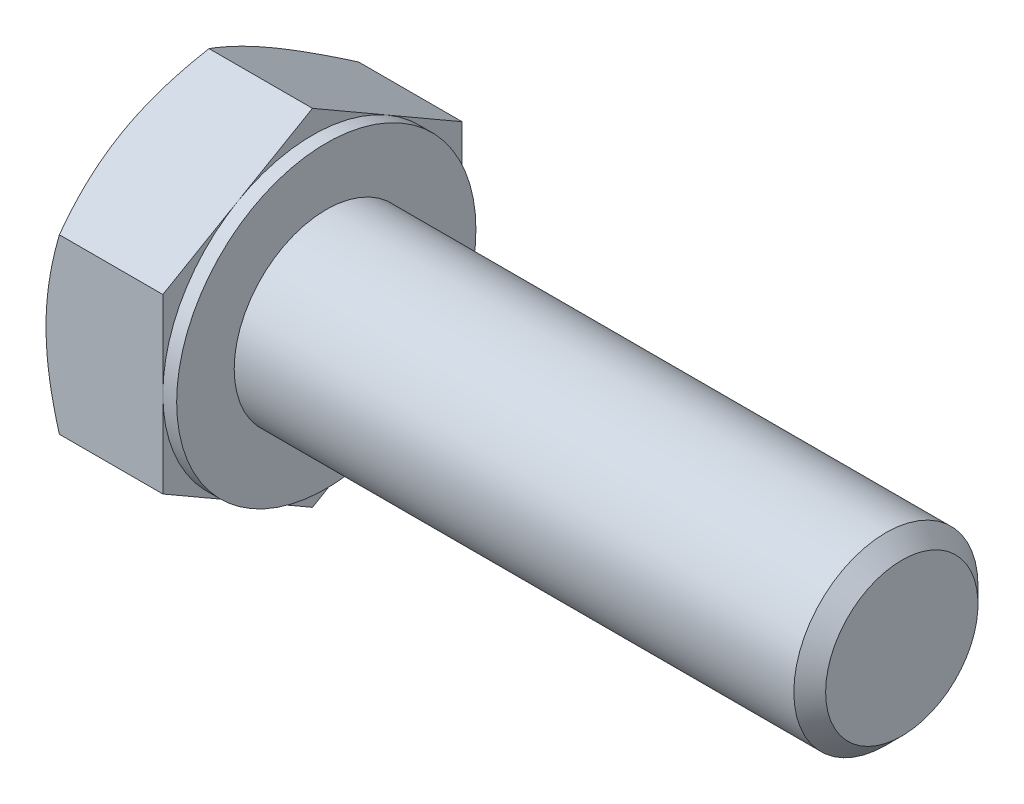
ISO-10303-21;
HEADER;
FILE_DESCRIPTION(('STEP AP214'),'2;1');
FILE_NAME('part.step','',(''),(''),'','','');
FILE_SCHEMA(('AUTOMOTIVE_DESIGN { 1 0 10303 214 1 1 1 1 }'));
ENDSEC;
DATA;
#1=APPLICATION_CONTEXT('core data for automotive mechanical design processes');
#2=APPLICATION_PROTOCOL_DEFINITION('international standard','automotive_design',2000,#1);
#3=PRODUCT_CONTEXT('',#1,'mechanical');
#4=PRODUCT('Part','Part','',(#3));
#5=PRODUCT_RELATED_PRODUCT_CATEGORY('part','',(#4));
#6=PRODUCT_DEFINITION_FORMATION('','',#4);
#7=PRODUCT_DEFINITION_CONTEXT('part definition',#1,'design');
#8=PRODUCT_DEFINITION('design','',#6,#7);
#9=PRODUCT_DEFINITION_SHAPE('','',#8);
#10=(LENGTH_UNIT() NAMED_UNIT(*) SI_UNIT(.MILLI.,.METRE.));
#11=(NAMED_UNIT(*) PLANE_ANGLE_UNIT() SI_UNIT($,.RADIAN.));
#12=(NAMED_UNIT(*) SI_UNIT($,.STERADIAN.) SOLID_ANGLE_UNIT());
#13=UNCERTAINTY_MEASURE_WITH_UNIT(LENGTH_MEASURE(1.E-05),#10,'distance_accuracy_value','');
#14=(GEOMETRIC_REPRESENTATION_CONTEXT(3) GLOBAL_UNCERTAINTY_ASSIGNED_CONTEXT((#13)) GLOBAL_UNIT_ASSIGNED_CONTEXT((#10,
#11,#12)) REPRESENTATION_CONTEXT('',''));
#15=CARTESIAN_POINT('',(0.,0.,0.));
#16=DIRECTION('',(0.,0.,1.));
#17=DIRECTION('',(1.,0.,0.));
#18=AXIS2_PLACEMENT_3D('',#15,#16,#17);
#19=CARTESIAN_POINT('',(5.675,7.50555349946514,0.));
#20=DIRECTION('',(1.,0.,0.));
#21=DIRECTION('',(0.,0.,-1.));
#22=AXIS2_PLACEMENT_3D('',#19,#20,#21);
#23=PLANE('',#22);
#24=CARTESIAN_POINT('',(5.675,0.,0.));
#25=DIRECTION('',(1.,0.,0.));
#26=DIRECTION('',(0.,0.,-1.));
#27=AXIS2_PLACEMENT_3D('',#24,#25,#26);
#28=CIRCLE('',#27,4.);
#29=CARTESIAN_POINT('',(5.675,0.,-4.));
#30=VERTEX_POINT('',#29);
#31=EDGE_CURVE('E273',#30,#30,#28,.F.);
#32=ORIENTED_EDGE('',*,*,#31,.T.);
#33=EDGE_LOOP('',(#32));
#34=FACE_BOUND('',#33,.T.);
#35=CARTESIAN_POINT('',(5.675,0.,0.));
#36=DIRECTION('',(1.,0.,0.));
#37=DIRECTION('',(0.,0.,-1.));
#38=AXIS2_PLACEMENT_3D('',#35,#36,#37);
#39=CIRCLE('',#38,6.5);
#40=CARTESIAN_POINT('',(5.675,0.,-6.5));
#41=VERTEX_POINT('',#40);
#42=EDGE_CURVE('E292',#41,#41,#39,.T.);
#43=ORIENTED_EDGE('',*,*,#42,.T.);
#44=EDGE_LOOP('',(#43));
#45=FACE_BOUND('',#44,.T.);
#46=ADVANCED_FACE('F35',(#34,#45),#23,.T.);
#47=CARTESIAN_POINT('',(0.,0.,0.));
#48=DIRECTION('',(-1.,0.,0.));
#49=DIRECTION('',(0.,0.,1.));
#50=AXIS2_PLACEMENT_3D('',#47,#48,#49);
#51=CYLINDRICAL_SURFACE('',#50,4.);
#52=ORIENTED_EDGE('',*,*,#31,.F.);
#53=EDGE_LOOP('',(#52));
#54=FACE_BOUND('',#53,.T.);
#55=CARTESIAN_POINT('',(29.9845,0.,0.));
#56=DIRECTION('',(-1.,0.,0.));
#57=DIRECTION('',(0.,0.,1.));
#58=AXIS2_PLACEMENT_3D('',#55,#56,#57);
#59=CIRCLE('',#58,4.);
#60=CARTESIAN_POINT('',(29.9845,0.,4.));
#61=VERTEX_POINT('',#60);
#62=EDGE_CURVE('E270',#61,#61,#59,.T.);
#63=ORIENTED_EDGE('',*,*,#62,.T.);
#64=EDGE_LOOP('',(#63));
#65=FACE_BOUND('',#64,.T.);
#66=ADVANCED_FACE('F244',(#54,#65),#51,.T.);
#67=CARTESIAN_POINT('',(30.675,0.,0.));
#68=DIRECTION('',(-1.,0.,0.));
#69=DIRECTION('',(0.,0.,1.));
#70=AXIS2_PLACEMENT_3D('',#67,#68,#69);
#71=CONICAL_SURFACE('',#70,3.3095,0.785398163397451);
#72=ORIENTED_EDGE('',*,*,#62,.F.);
#73=EDGE_LOOP('',(#72));
#74=FACE_BOUND('',#73,.T.);
#75=CARTESIAN_POINT('',(30.675,0.,0.));
#76=DIRECTION('',(-1.,0.,0.));
#77=DIRECTION('',(0.,0.,1.));
#78=AXIS2_PLACEMENT_3D('',#75,#76,#77);
#79=CIRCLE('',#78,3.3095);
#80=CARTESIAN_POINT('',(30.675,0.,3.3095));
#81=VERTEX_POINT('',#80);
#82=EDGE_CURVE('E268',#81,#81,#79,.T.);
#83=ORIENTED_EDGE('',*,*,#82,.T.);
#84=EDGE_LOOP('',(#83));
#85=FACE_BOUND('',#84,.T.);
#86=ADVANCED_FACE('F249',(#74,#85),#71,.T.);
#87=CARTESIAN_POINT('',(30.675,0.,0.));
#88=DIRECTION('',(-1.,0.,0.));
#89=DIRECTION('',(0.,0.,1.));
#90=AXIS2_PLACEMENT_3D('',#87,#88,#89);
#91=PLANE('',#90);
#92=ORIENTED_EDGE('',*,*,#82,.F.);
#93=EDGE_LOOP('',(#92));
#94=FACE_BOUND('',#93,.T.);
#95=ADVANCED_FACE('F256',(#94),#91,.F.);
#96=CARTESIAN_POINT('',(5.075,6.5,0.));
#97=DIRECTION('',(1.,0.,0.));
#98=DIRECTION('',(0.,0.,-1.));
#99=AXIS2_PLACEMENT_3D('',#96,#97,#98);
#100=PLANE('',#99);
#101=DIRECTION('',(0.,0.500000000000001,0.866025403784438));
#102=VECTOR('',#101,1.);
#103=CARTESIAN_POINT('',(5.075,3.75277674973256,-6.5));
#104=LINE('',#103,#102);
#105=CARTESIAN_POINT('',(5.075,3.75277674973256,-6.5));
#106=VERTEX_POINT('',#105);
#107=CARTESIAN_POINT('',(5.075,5.62916512459885,-3.25000000000001));
#108=VERTEX_POINT('',#107);
#109=EDGE_CURVE('E168',#106,#108,#104,.T.);
#110=ORIENTED_EDGE('',*,*,#109,.T.);
#111=CARTESIAN_POINT('',(5.075,0.,0.));
#112=DIRECTION('',(-1.,0.,0.));
#113=DIRECTION('',(0.,0.,1.));
#114=AXIS2_PLACEMENT_3D('',#111,#112,#113);
#115=CIRCLE('',#114,6.5);
#116=CARTESIAN_POINT('',(5.075,0.,-6.5));
#117=VERTEX_POINT('',#116);
#118=EDGE_CURVE('E51',#108,#117,#115,.T.);
#119=ORIENTED_EDGE('',*,*,#118,.T.);
#120=DIRECTION('',(0.,1.,0.));
#121=VECTOR('',#120,1.);
#122=CARTESIAN_POINT('',(5.075,3.75277674973256,-6.5));
#123=LINE('',#122,#121);
#124=EDGE_CURVE('E40',#117,#106,#123,.T.);
#125=ORIENTED_EDGE('',*,*,#124,.T.);
#126=EDGE_LOOP('',(#110,#119,#125));
#127=FACE_BOUND('',#126,.T.);
#128=ADVANCED_FACE('F259',(#127),#100,.T.);
#129=CARTESIAN_POINT('',(5.075,7.50555349946514,0.));
#130=VERTEX_POINT('',#129);
#131=EDGE_CURVE('E166',#108,#130,#104,.T.);
#132=ORIENTED_EDGE('',*,*,#131,.T.);
#133=DIRECTION('',(0.,-0.500000000000001,0.866025403784438));
#134=VECTOR('',#133,1.);
#135=CARTESIAN_POINT('',(5.075,7.50555349946514,0.));
#136=LINE('',#135,#134);
#137=CARTESIAN_POINT('',(5.075,5.62916512459885,3.25000000000001));
#138=VERTEX_POINT('',#137);
#139=EDGE_CURVE('E165',#130,#138,#136,.T.);
#140=ORIENTED_EDGE('',*,*,#139,.T.);
#141=EDGE_CURVE('E154',#138,#108,#115,.T.);
#142=ORIENTED_EDGE('',*,*,#141,.T.);
#143=EDGE_LOOP('',(#132,#140,#142));
#144=FACE_BOUND('',#143,.T.);
#145=ADVANCED_FACE('F264',(#144),#100,.T.);
#146=CARTESIAN_POINT('',(5.075,3.75277674973256,6.5));
#147=VERTEX_POINT('',#146);
#148=EDGE_CURVE('E133',#138,#147,#136,.T.);
#149=ORIENTED_EDGE('',*,*,#148,.T.);
#150=DIRECTION('',(0.,-1.,0.));
#151=VECTOR('',#150,1.);
#152=CARTESIAN_POINT('',(5.075,3.75277674973256,6.5));
#153=LINE('',#152,#151);
#154=CARTESIAN_POINT('',(5.075,0.,6.5));
#155=VERTEX_POINT('',#154);
#156=EDGE_CURVE('E127',#147,#155,#153,.T.);
#157=ORIENTED_EDGE('',*,*,#156,.T.);
#158=EDGE_CURVE('E131',#155,#138,#115,.T.);
#159=ORIENTED_EDGE('',*,*,#158,.T.);
#160=EDGE_LOOP('',(#149,#157,#159));
#161=FACE_BOUND('',#160,.T.);
#162=ADVANCED_FACE('F129',(#161),#100,.T.);
#163=CARTESIAN_POINT('',(5.075,-3.75277674973256,6.5));
#164=VERTEX_POINT('',#163);
#165=EDGE_CURVE('E137',#155,#164,#153,.T.);
#166=ORIENTED_EDGE('',*,*,#165,.T.);
#167=DIRECTION('',(0.,-0.500000000000002,-0.866025403784438));
#168=VECTOR('',#167,1.);
#169=CARTESIAN_POINT('',(5.075,-7.50555349946515,0.));
#170=LINE('',#169,#168);
#171=CARTESIAN_POINT('',(5.075,-5.62916512459884,3.25000000000001));
#172=VERTEX_POINT('',#171);
#173=EDGE_CURVE('E144',#164,#172,#170,.T.);
#174=ORIENTED_EDGE('',*,*,#173,.T.);
#175=EDGE_CURVE('E141',#172,#155,#115,.T.);
#176=ORIENTED_EDGE('',*,*,#175,.T.);
#177=EDGE_LOOP('',(#166,#174,#176));
#178=FACE_BOUND('',#177,.T.);
#179=ADVANCED_FACE('F142',(#178),#100,.T.);
#180=CARTESIAN_POINT('',(5.075,-7.50555349946515,0.));
#181=VERTEX_POINT('',#180);
#182=EDGE_CURVE('E160',#172,#181,#170,.T.);
#183=ORIENTED_EDGE('',*,*,#182,.T.);
#184=DIRECTION('',(0.,0.5,-0.866025403784439));
#185=VECTOR('',#184,1.);
#186=CARTESIAN_POINT('',(5.075,-3.75277674973258,-6.5));
#187=LINE('',#186,#185);
#188=CARTESIAN_POINT('',(5.075,-5.62916512459885,-3.25));
#189=VERTEX_POINT('',#188);
#190=EDGE_CURVE('E328',#181,#189,#187,.T.);
#191=ORIENTED_EDGE('',*,*,#190,.T.);
#192=EDGE_CURVE('E148',#189,#172,#115,.T.);
#193=ORIENTED_EDGE('',*,*,#192,.T.);
#194=EDGE_LOOP('',(#183,#191,#193));
#195=FACE_BOUND('',#194,.T.);
#196=ADVANCED_FACE('F333',(#195),#100,.T.);
#197=CARTESIAN_POINT('',(5.075,-3.75277674973258,-6.5));
#198=VERTEX_POINT('',#197);
#199=EDGE_CURVE('E155',#189,#198,#187,.T.);
#200=ORIENTED_EDGE('',*,*,#199,.T.);
#201=EDGE_CURVE('E11',#198,#117,#123,.T.);
#202=ORIENTED_EDGE('',*,*,#201,.T.);
#203=EDGE_CURVE('E346',#117,#189,#115,.T.);
#204=ORIENTED_EDGE('',*,*,#203,.T.);
#205=EDGE_LOOP('',(#200,#202,#204));
#206=FACE_BOUND('',#205,.T.);
#207=ADVANCED_FACE('F265',(#206),#100,.T.);
#208=CARTESIAN_POINT('',(0.,0.,0.));
#209=DIRECTION('',(-1.,0.,0.));
#210=DIRECTION('',(0.,0.,1.));
#211=AXIS2_PLACEMENT_3D('',#208,#209,#210);
#212=CYLINDRICAL_SURFACE('',#211,6.5);
#213=ORIENTED_EDGE('',*,*,#118,.F.);
#214=ORIENTED_EDGE('',*,*,#141,.F.);
#215=ORIENTED_EDGE('',*,*,#158,.F.);
#216=ORIENTED_EDGE('',*,*,#175,.F.);
#217=ORIENTED_EDGE('',*,*,#192,.F.);
#218=ORIENTED_EDGE('',*,*,#203,.F.);
#219=EDGE_LOOP('',(#213,#214,#215,#216,#217,#218));
#220=FACE_BOUND('',#219,.T.);
#221=ORIENTED_EDGE('',*,*,#42,.F.);
#222=EDGE_LOOP('',(#221));
#223=FACE_BOUND('',#222,.T.);
#224=ADVANCED_FACE('F151',(#220,#223),#212,.T.);
#225=CARTESIAN_POINT('',(0.,7.50555349946514,0.));
#226=DIRECTION('',(1.,0.,0.));
#227=DIRECTION('',(0.,0.,-1.));
#228=AXIS2_PLACEMENT_3D('',#225,#226,#227);
#229=PLANE('',#228);
#230=CARTESIAN_POINT('',(0.,0.,0.));
#231=DIRECTION('',(1.,0.,0.));
#232=DIRECTION('',(0.,0.,-1.));
#233=AXIS2_PLACEMENT_3D('',#230,#231,#232);
#234=CIRCLE('',#233,6.5);
#235=CARTESIAN_POINT('',(0.,0.,-6.5));
#236=VERTEX_POINT('',#235);
#237=CARTESIAN_POINT('',(0.,5.62916512459885,-3.25000000000001));
#238=VERTEX_POINT('',#237);
#239=EDGE_CURVE('E291',#236,#238,#234,.T.);
#240=ORIENTED_EDGE('',*,*,#239,.F.);
#241=CARTESIAN_POINT('',(0.,-5.62916512459885,-3.25));
#242=VERTEX_POINT('',#241);
#243=EDGE_CURVE('E288',#242,#236,#234,.T.);
#244=ORIENTED_EDGE('',*,*,#243,.F.);
#245=CARTESIAN_POINT('',(0.,-5.62916512459884,3.25000000000001));
#246=VERTEX_POINT('',#245);
#247=EDGE_CURVE('E290',#246,#242,#234,.T.);
#248=ORIENTED_EDGE('',*,*,#247,.F.);
#249=CARTESIAN_POINT('',(0.,0.,6.5));
#250=VERTEX_POINT('',#249);
#251=EDGE_CURVE('E300',#250,#246,#234,.T.);
#252=ORIENTED_EDGE('',*,*,#251,.F.);
#253=CARTESIAN_POINT('',(0.,0.,0.));
#254=DIRECTION('',(-1.,0.,0.));
#255=DIRECTION('',(0.,0.,1.));
#256=AXIS2_PLACEMENT_3D('',#253,#254,#255);
#257=CIRCLE('',#256,6.5);
#258=CARTESIAN_POINT('',(0.,5.62916512459885,3.25000000000001));
#259=VERTEX_POINT('',#258);
#260=EDGE_CURVE('E169',#250,#259,#257,.T.);
#261=ORIENTED_EDGE('',*,*,#260,.T.);
#262=EDGE_CURVE('E295',#238,#259,#234,.T.);
#263=ORIENTED_EDGE('',*,*,#262,.F.);
#264=EDGE_LOOP('',(#240,#244,#248,#252,#261,#263));
#265=FACE_BOUND('',#264,.T.);
#266=ADVANCED_FACE('F198',(#265),#229,.F.);
#267=CARTESIAN_POINT('',(0.,0.,0.));
#268=DIRECTION('',(1.,0.,0.));
#269=DIRECTION('',(0.,0.,-1.));
#270=AXIS2_PLACEMENT_3D('',#267,#268,#269);
#271=CONICAL_SURFACE('',#270,6.5,1.0471975511966);
#272=CARTESIAN_POINT('',(0.580623251805865,3.75266127967872,6.5002));
#273=CARTESIAN_POINT('',(0.533004423075484,3.8351516191275,6.35732254094112));
#274=CARTESIAN_POINT('',(0.487546700602704,3.91794952254312,6.21391236546509));
#275=CARTESIAN_POINT('',(0.401548682023044,4.08421773795794,5.9259273686828));
#276=CARTESIAN_POINT('',(0.361010507228024,4.16768832359105,5.78135207342873));
#277=CARTESIAN_POINT('',(0.247571001123207,4.41943655294051,5.34531134947996));
#278=CARTESIAN_POINT('',(0.183047807128738,4.58870793403689,5.05212471715368));
#279=CARTESIAN_POINT('',(0.107386583547491,4.84201947708215,4.61337625445563));
#280=CARTESIAN_POINT('',(0.085832856456987,4.92530276780316,4.46912536350531));
#281=CARTESIAN_POINT('',(0.0496903146061188,5.09224566542477,4.17997178286191));
#282=CARTESIAN_POINT('',(0.0351008844596665,5.17590523841627,4.03506915190111));
#283=CARTESIAN_POINT('',(0.013258752507347,5.34336968579964,3.74501222057168));
#284=CARTESIAN_POINT('',(0.0059977243221083,5.427174286676,3.59985839394579));
#285=CARTESIAN_POINT('',(-0.00103969741776804,5.59485627940483,3.30942466302505));
#286=CARTESIAN_POINT('',(-0.000816322187794951,5.6787336689286,3.16414476276364));
#287=CARTESIAN_POINT('',(0.0100834585151655,5.90853103021317,2.76612405757351));
#288=CARTESIAN_POINT('',(0.0283818178694137,6.05437578112763,2.51351353897243));
#289=CARTESIAN_POINT('',(0.0864063414576758,6.34509659313135,2.00997032176432));
#290=CARTESIAN_POINT('',(0.126152338538245,6.48997163178545,1.75903939406692));
#291=CARTESIAN_POINT('',(0.225505903202151,6.78127752911039,1.25448277935568));
#292=CARTESIAN_POINT('',(0.285534425638028,6.92767163007068,1.00092075856409));
#293=CARTESIAN_POINT('',(0.421774992509871,7.21827667013277,0.497578064240955));
#294=CARTESIAN_POINT('',(0.497955034163596,7.36249133098589,0.247790944447036));
#295=CARTESIAN_POINT('',(0.58062325180587,7.50566896951898,-0.000200000000000213));
#296=B_SPLINE_CURVE_WITH_KNOTS('',3,(#272,#273,#274,#275,#276,#277,#278,#279,#280,#281,#282,
#283,#284,#285,#286,#287,#288,#289,#290,#291,#292,#293,#294,#295),.UNSPECIFIED.,.F.,.F.,(4,2,2,
2,2,2,2,2,2,2,2,4),(0.,0.515105052395587,1.03043143507524,2.06322554824262,2.56697389547996,
3.07067772176454,3.57380860368928,4.0769239424252,4.9527935470566,5.82947446853466,
6.72559912449737,7.61996451221046),.UNSPECIFIED.);
#297=CARTESIAN_POINT('',(0.580556583600766,7.50555349946514,0.));
#298=VERTEX_POINT('',#297);
#299=EDGE_CURVE('E216',#259,#298,#296,.T.);
#300=ORIENTED_EDGE('',*,*,#299,.T.);
#301=CARTESIAN_POINT('',(0.58062325180587,7.50566896951898,0.0002));
#302=CARTESIAN_POINT('',(0.533004423075488,7.4231786300702,-0.14267745905888));
#303=CARTESIAN_POINT('',(0.487546700602709,7.34038072665458,-0.286087634534912));
#304=CARTESIAN_POINT('',(0.401548682023048,7.17411251123976,-0.574072631317195));
#305=CARTESIAN_POINT('',(0.361010507228028,7.09064192560665,-0.718647926571264));
#306=CARTESIAN_POINT('',(0.247571001123211,6.83889369625719,-1.15468865052003));
#307=CARTESIAN_POINT('',(0.183047807128741,6.66962231516081,-1.44787528284632));
#308=CARTESIAN_POINT('',(0.107386583547493,6.41631077211555,-1.88662374554437));
#309=CARTESIAN_POINT('',(0.0858328564569882,6.33302748139454,-2.03087463649469));
#310=CARTESIAN_POINT('',(0.0496903146061196,6.16608458377293,-2.32002821713809));
#311=CARTESIAN_POINT('',(0.0351008844596673,6.08242501078143,-2.46493084809889));
#312=CARTESIAN_POINT('',(0.0132587525073474,5.91496056339806,-2.75498777942832));
#313=CARTESIAN_POINT('',(0.00599772432210811,5.8311559625217,-2.90014160605421));
#314=CARTESIAN_POINT('',(-0.0010396974177686,5.66347396979287,-3.19057533697495));
#315=CARTESIAN_POINT('',(-0.000816322187795327,5.5795965802691,-3.33585523723636));
#316=CARTESIAN_POINT('',(0.0100834585151651,5.34979921898453,-3.73387594242649));
#317=CARTESIAN_POINT('',(0.0283818178694128,5.20395446807007,-3.98648646102757));
#318=CARTESIAN_POINT('',(0.086406341457674,4.91323365606635,-4.49002967823568));
#319=CARTESIAN_POINT('',(0.126152338538243,4.76835861741225,-4.74096060593308));
#320=CARTESIAN_POINT('',(0.225505903202148,4.47705272008731,-5.24551722064432));
#321=CARTESIAN_POINT('',(0.285534425638025,4.33065861912702,-5.49907924143591));
#322=CARTESIAN_POINT('',(0.421774992509866,4.04005357906493,-6.00242193575904));
#323=CARTESIAN_POINT('',(0.497955034163591,3.89583891821181,-6.25220905555296));
#324=CARTESIAN_POINT('',(0.580623251805865,3.75266127967872,-6.5002));
#325=B_SPLINE_CURVE_WITH_KNOTS('',3,(#301,#302,#303,#304,#305,#306,#307,#308,#309,#310,#311,
#312,#313,#314,#315,#316,#317,#318,#319,#320,#321,#322,#323,#324),.UNSPECIFIED.,.F.,.F.,(4,2,2,
2,2,2,2,2,2,2,2,4),(0.,0.515105052395588,1.03043143507525,2.06322554824262,2.56697389547997,
3.07067772176454,3.57380860368928,4.0769239424252,4.9527935470566,5.82947446853467,
6.72559912449737,7.61996451221046),.UNSPECIFIED.);
#326=EDGE_CURVE('E59',#298,#238,#325,.T.);
#327=ORIENTED_EDGE('',*,*,#326,.T.);
#328=ORIENTED_EDGE('',*,*,#262,.T.);
#329=EDGE_LOOP('',(#300,#327,#328));
#330=FACE_BOUND('',#329,.T.);
#331=ADVANCED_FACE('F342',(#330),#271,.T.);
#332=CARTESIAN_POINT('',(3.18835311590245,-10.1137456678934,6.5));
#333=CARTESIAN_POINT('',(3.05034774010467,-9.82952666322136,6.5));
#334=CARTESIAN_POINT('',(2.91365616489937,-9.54465869649272,6.5));
#335=CARTESIAN_POINT('',(2.64363899497541,-8.9732797805792,6.5));
#336=CARTESIAN_POINT('',(2.51031392459096,-8.6867685838847,6.5));
#337=CARTESIAN_POINT('',(2.24710473482718,-8.11029837842687,6.5));
#338=CARTESIAN_POINT('',(2.1172430043868,-7.8203291120151,6.5));
#339=CARTESIAN_POINT('',(1.86279082826902,-7.23809541022338,6.5));
#340=CARTESIAN_POINT('',(1.73820013554674,-6.94583108317206,6.5));
#341=CARTESIAN_POINT('',(1.49176685426961,-6.34906440963035,6.5));
#342=CARTESIAN_POINT('',(1.37014257641265,-6.04447142288871,6.5));
#343=CARTESIAN_POINT('',(1.13601865758149,-5.43173420957314,6.5));
#344=CARTESIAN_POINT('',(1.02352003558022,-5.12358959079844,6.5));
#345=CARTESIAN_POINT('',(0.810575368239914,-4.50382569782258,6.5));
#346=CARTESIAN_POINT('',(0.710105232302002,-4.19221478266991,6.5));
#347=CARTESIAN_POINT('',(0.524420166144451,-3.56452019206011,6.5));
#348=CARTESIAN_POINT('',(0.439200468206415,-3.24843794792919,6.5));
#349=CARTESIAN_POINT('',(0.288524223401195,-2.61335465712781,6.5));
#350=CARTESIAN_POINT('',(0.222961865744746,-2.29437912059504,6.5));
#351=CARTESIAN_POINT('',(0.115312883130724,-1.65238219405861,6.5));
#352=CARTESIAN_POINT('',(0.0732239014690623,-1.32936121354429,6.5));
#353=CARTESIAN_POINT('',(0.030488713638166,-0.845231171839972,6.5));
#354=CARTESIAN_POINT('',(0.0196493434273841,-0.68498220966309,6.5));
#355=CARTESIAN_POINT('',(0.00475298486144011,-0.364162349065448,6.5));
#356=CARTESIAN_POINT('',(0.000695882908832421,-0.203591456081867,6.5));
#357=CARTESIAN_POINT('',(-0.000531597190094377,0.117577430374309,6.5));
#358=CARTESIAN_POINT('',(0.00229809017012774,0.278175424090155,6.5));
#359=CARTESIAN_POINT('',(0.0147726845547651,0.599108972823518,6.5));
#360=CARTESIAN_POINT('',(0.0244179260500531,0.75944451457423,6.5));
#361=CARTESIAN_POINT('',(0.0554961939343019,1.14369946602535,6.5));
#362=CARTESIAN_POINT('',(0.0801030490514539,1.36736763045087,6.5));
#363=CARTESIAN_POINT('',(0.141246537453381,1.81305591311689,6.5));
#364=CARTESIAN_POINT('',(0.177784759614455,2.0350758078311,6.5));
#365=CARTESIAN_POINT('',(0.303360001332119,2.69839633433797,6.5));
#366=CARTESIAN_POINT('',(0.408335815147599,3.13672010374359,6.5));
#367=CARTESIAN_POINT('',(0.590564593134946,3.7923211291812,6.5));
#368=CARTESIAN_POINT('',(0.656313198979098,4.01299150874075,6.5));
#369=CARTESIAN_POINT('',(0.794681634200739,4.45218859008393,6.5));
#370=CARTESIAN_POINT('',(0.867301513122624,4.67071527639821,6.5));
#371=CARTESIAN_POINT('',(1.01824353854296,5.10569490252728,6.5));
#372=CARTESIAN_POINT('',(1.0965638823284,5.32214847365077,6.5));
#373=CARTESIAN_POINT('',(1.25798086164822,5.75325725773041,6.5));
#374=CARTESIAN_POINT('',(1.34107741035996,5.96791250329558,6.5));
#375=CARTESIAN_POINT('',(1.56029019583042,6.51888445936375,6.5));
#376=CARTESIAN_POINT('',(1.69936356666535,6.85402316813629,6.5));
#377=CARTESIAN_POINT('',(1.98501958087354,7.52109583939395,6.5));
#378=CARTESIAN_POINT('',(2.13160288780792,7.85302951559935,6.5));
#379=CARTESIAN_POINT('',(2.43059748044952,8.51437865518659,6.5));
#380=CARTESIAN_POINT('',(2.5830105759696,8.84379329784095,6.5));
#381=CARTESIAN_POINT('',(2.89234869374927,9.50047798683786,6.5));
#382=CARTESIAN_POINT('',(3.04927357220059,9.82774810112758,6.5));
#383=CARTESIAN_POINT('',(3.36692013130637,10.4809971975748,6.5));
#384=CARTESIAN_POINT('',(3.52764676491734,10.8069737667408,6.5));
#385=CARTESIAN_POINT('',(3.851985555549,11.4574882901034,6.5));
#386=CARTESIAN_POINT('',(4.01559773123066,11.7820262349792,6.5));
#387=CARTESIAN_POINT('',(4.50986185003774,12.7537468114441,6.5));
#388=CARTESIAN_POINT('',(4.84399997978541,13.3991555932469,6.5));
#389=CARTESIAN_POINT('',(5.4857599026592,14.6239779290894,6.5));
#390=CARTESIAN_POINT('',(5.79279643372279,15.2036995760604,6.5));
#391=CARTESIAN_POINT('',(6.4106918822763,16.3611382637875,6.5));
#392=CARTESIAN_POINT('',(6.72155099010109,16.938855202873,6.5));
#393=CARTESIAN_POINT('',(7.34519775439014,18.0910273555999,6.5));
#394=CARTESIAN_POINT('',(7.65797694168864,18.665487160613,6.5));
#395=CARTESIAN_POINT('',(8.28574397153078,19.8131486204439,6.5));
#396=CARTESIAN_POINT('',(8.60073166294279,20.3863503578957,6.5));
#397=CARTESIAN_POINT('',(8.91652967168741,20.9591024521449,6.5));
#398=B_SPLINE_CURVE_WITH_KNOTS('',3,(#332,#333,#334,#335,#336,#337,#338,#339,#340,#341,#342,
#343,#344,#345,#346,#347,#348,#349,#350,#351,#352,#353,#354,#355,#356,#357,#358,#359,#360,#361,
#362,#363,#364,#365,#366,#367,#368,#369,#370,#371,#372,#373,#374,#375,#376,#377,#378,#379,#380,
#381,#382,#383,#384,#385,#386,#387,#388,#389,#390,#391,#392,#393,#394,#395,#396,#397),
.UNSPECIFIED.,.F.,.F.,(4,2,2,2,2,2,2,2,2,2,2,2,2,2,2,2,2,2,2,2,2,2,2,2,2,2,2,2,2,2,2,2,4),(0.,
0.947868666702312,1.89588406483492,2.84900320930536,3.80207763304314,4.7858977408271,
5.76982755141752,6.75175256246684,7.73337005764393,8.70960474890991,9.68574140951123,
10.1674651053568,10.6491807326436,11.1309009419855,11.6126447932157,12.287317572382,
12.9620802330383,14.312318438093,15.0030310344276,15.6937486114326,16.3842486973571,
17.0747362352244,18.1631508683747,19.2516618378194,20.3405135142583,21.4293305231019,
22.5196540547637,23.6099846401957,25.7902468235016,27.7582608872417,29.7263733429304,
31.6886408595598,33.6507753806319),.UNSPECIFIED.);
#399=CARTESIAN_POINT('',(0.580556583600761,3.75277674973256,6.5));
#400=VERTEX_POINT('',#399);
#401=EDGE_CURVE('E228',#250,#400,#398,.T.);
#402=ORIENTED_EDGE('',*,*,#401,.T.);
#403=EDGE_CURVE('E227',#400,#259,#296,.T.);
#404=ORIENTED_EDGE('',*,*,#403,.T.);
#405=ORIENTED_EDGE('',*,*,#260,.F.);
#406=EDGE_LOOP('',(#402,#404,#405));
#407=FACE_BOUND('',#406,.T.);
#408=ADVANCED_FACE('F338',(#407),#271,.T.);
#409=CARTESIAN_POINT('',(0.580556583600761,-3.75277674973256,6.5));
#410=VERTEX_POINT('',#409);
#411=EDGE_CURVE('E271',#410,#250,#398,.T.);
#412=ORIENTED_EDGE('',*,*,#411,.T.);
#413=ORIENTED_EDGE('',*,*,#251,.T.);
#414=CARTESIAN_POINT('',(0.580623251805874,-7.50566896951899,-0.000200000000000067));
#415=CARTESIAN_POINT('',(0.533004423075492,-7.42317863007021,0.14267745905888));
#416=CARTESIAN_POINT('',(0.487546700602713,-7.34038072665459,0.286087634534913));
#417=CARTESIAN_POINT('',(0.401548682023052,-7.17411251123977,0.574072631317195));
#418=CARTESIAN_POINT('',(0.361010507228031,-7.09064192560666,0.718647926571264));
#419=CARTESIAN_POINT('',(0.247571001123214,-6.8388936962572,1.15468865052003));
#420=CARTESIAN_POINT('',(0.183047807128744,-6.66962231516081,1.44787528284632));
#421=CARTESIAN_POINT('',(0.107386583547496,-6.41631077211556,1.88662374554437));
#422=CARTESIAN_POINT('',(0.0858328564569915,-6.33302748139455,2.03087463649469));
#423=CARTESIAN_POINT('',(0.0496903146061228,-6.16608458377294,2.32002821713809));
#424=CARTESIAN_POINT('',(0.0351008844596701,-6.08242501078143,2.46493084809889));
#425=CARTESIAN_POINT('',(0.0132587525073496,-5.91496056339807,2.75498777942832));
#426=CARTESIAN_POINT('',(0.00599772432211023,-5.83115596252171,2.90014160605421));
#427=CARTESIAN_POINT('',(-0.00103969741776672,-5.66347396979287,3.19057533697495));
#428=CARTESIAN_POINT('',(-0.000816322187793604,-5.5795965802691,3.33585523723636));
#429=CARTESIAN_POINT('',(0.0100834585151665,-5.34979921898453,3.73387594242649));
#430=CARTESIAN_POINT('',(0.0283818178694141,-5.20395446807007,3.98648646102757));
#431=CARTESIAN_POINT('',(0.0864063414576751,-4.91323365606636,4.49002967823568));
#432=CARTESIAN_POINT('',(0.126152338538244,-4.76835861741226,4.74096060593308));
#433=CARTESIAN_POINT('',(0.225505903202148,-4.47705272008731,5.24551722064432));
#434=CARTESIAN_POINT('',(0.285534425638025,-4.33065861912702,5.49907924143591));
#435=CARTESIAN_POINT('',(0.421774992509866,-4.04005357906493,6.00242193575904));
#436=CARTESIAN_POINT('',(0.49795503416359,-3.89583891821181,6.25220905555296));
#437=CARTESIAN_POINT('',(0.580623251805865,-3.75266127967872,6.5002));
#438=B_SPLINE_CURVE_WITH_KNOTS('',3,(#414,#415,#416,#417,#418,#419,#420,#421,#422,#423,#424,
#425,#426,#427,#428,#429,#430,#431,#432,#433,#434,#435,#436,#437),.UNSPECIFIED.,.F.,.F.,(4,2,2,
2,2,2,2,2,2,2,2,4),(0.,0.515105052395589,1.03043143507525,2.06322554824263,2.56697389547997,
3.07067772176454,3.57380860368928,4.07692394242521,4.95279354705661,5.82947446853467,
6.72559912449737,7.61996451221046),.UNSPECIFIED.);
#439=EDGE_CURVE('E218',#246,#410,#438,.T.);
#440=ORIENTED_EDGE('',*,*,#439,.T.);
#441=EDGE_LOOP('',(#412,#413,#440));
#442=FACE_BOUND('',#441,.T.);
#443=ADVANCED_FACE('F187',(#442),#271,.T.);
#444=CARTESIAN_POINT('',(0.58055658360077,-7.50555349946515,0.));
#445=VERTEX_POINT('',#444);
#446=EDGE_CURVE('E211',#445,#246,#438,.T.);
#447=ORIENTED_EDGE('',*,*,#446,.T.);
#448=ORIENTED_EDGE('',*,*,#247,.T.);
#449=CARTESIAN_POINT('',(0.58062325180587,-3.75266127967874,-6.5002));
#450=CARTESIAN_POINT('',(0.533004423075488,-3.83515161912751,-6.35732254094112));
#451=CARTESIAN_POINT('',(0.487546700602709,-3.91794952254313,-6.21391236546509));
#452=CARTESIAN_POINT('',(0.401548682023048,-4.08421773795795,-5.9259273686828));
#453=CARTESIAN_POINT('',(0.361010507228028,-4.16768832359106,-5.78135207342873));
#454=CARTESIAN_POINT('',(0.247571001123211,-4.41943655294052,-5.34531134947996));
#455=CARTESIAN_POINT('',(0.183047807128743,-4.58870793403691,-5.05212471715368));
#456=CARTESIAN_POINT('',(0.107386583547496,-4.84201947708216,-4.61337625445562));
#457=CARTESIAN_POINT('',(0.0858328564569919,-4.92530276780317,-4.46912536350531));
#458=CARTESIAN_POINT('',(0.0496903146061237,-5.09224566542478,-4.17997178286191));
#459=CARTESIAN_POINT('',(0.0351008844596714,-5.17590523841628,-4.03506915190111));
#460=CARTESIAN_POINT('',(0.0132587525073521,-5.34336968579965,-3.74501222057168));
#461=CARTESIAN_POINT('',(0.00599772432211346,-5.42717428667601,-3.59985839394579));
#462=CARTESIAN_POINT('',(-0.00103969741776268,-5.59485627940485,-3.30942466302505));
#463=CARTESIAN_POINT('',(-0.000816322187789515,-5.67873366892861,-3.16414476276364));
#464=CARTESIAN_POINT('',(0.0100834585151711,-5.90853103021318,-2.7661240575735));
#465=CARTESIAN_POINT('',(0.0283818178694193,-6.05437578112764,-2.51351353897243));
#466=CARTESIAN_POINT('',(0.0864063414576815,-6.34509659313136,-2.00997032176432));
#467=CARTESIAN_POINT('',(0.126152338538251,-6.48997163178546,-1.75903939406692));
#468=CARTESIAN_POINT('',(0.225505903202156,-6.7812775291104,-1.25448277935568));
#469=CARTESIAN_POINT('',(0.285534425638033,-6.92767163007069,-1.00092075856408));
#470=CARTESIAN_POINT('',(0.421774992509875,-7.21827667013278,-0.497578064240955));
#471=CARTESIAN_POINT('',(0.4979550341636,-7.3624913309859,-0.247790944447036));
#472=CARTESIAN_POINT('',(0.580623251805874,-7.50566896951898,0.000200000000000092));
#473=B_SPLINE_CURVE_WITH_KNOTS('',3,(#449,#450,#451,#452,#453,#454,#455,#456,#457,#458,#459,
#460,#461,#462,#463,#464,#465,#466,#467,#468,#469,#470,#471,#472),.UNSPECIFIED.,.F.,.F.,(4,2,2,
2,2,2,2,2,2,2,2,4),(0.,0.515105052395588,1.03043143507525,2.06322554824262,2.56697389547997,
3.07067772176454,3.57380860368928,4.0769239424252,4.9527935470566,5.82947446853466,
6.72559912449736,7.61996451221046),.UNSPECIFIED.);
#474=EDGE_CURVE('E217',#242,#445,#473,.T.);
#475=ORIENTED_EDGE('',*,*,#474,.T.);
#476=EDGE_LOOP('',(#447,#448,#475));
#477=FACE_BOUND('',#476,.T.);
#478=ADVANCED_FACE('F309',(#477),#271,.T.);
#479=CARTESIAN_POINT('',(0.580556583600761,3.75277674973256,-6.5));
#480=VERTEX_POINT('',#479);
#481=EDGE_CURVE('E219',#238,#480,#325,.T.);
#482=ORIENTED_EDGE('',*,*,#481,.T.);
#483=CARTESIAN_POINT('',(3.18835311590246,-10.1137456678934,-6.5));
#484=CARTESIAN_POINT('',(3.05034774010468,-9.82952666322138,-6.5));
#485=CARTESIAN_POINT('',(2.91365616489938,-9.54465869649274,-6.5));
#486=CARTESIAN_POINT('',(2.64363899497542,-8.97327978057922,-6.5));
#487=CARTESIAN_POINT('',(2.51031392459097,-8.68676858388472,-6.5));
#488=CARTESIAN_POINT('',(2.24710473482719,-8.11029837842689,-6.5));
#489=CARTESIAN_POINT('',(2.1172430043868,-7.82032911201512,-6.5));
#490=CARTESIAN_POINT('',(1.86279082826903,-7.2380954102234,-6.5));
#491=CARTESIAN_POINT('',(1.73820013554674,-6.94583108317207,-6.5));
#492=CARTESIAN_POINT('',(1.49176685426961,-6.34906440963036,-6.5));
#493=CARTESIAN_POINT('',(1.37014257641265,-6.04447142288872,-6.5));
#494=CARTESIAN_POINT('',(1.13601865758149,-5.43173420957315,-6.5));
#495=CARTESIAN_POINT('',(1.02352003558022,-5.12358959079846,-6.5));
#496=CARTESIAN_POINT('',(0.810575368239918,-4.5038256978226,-6.5));
#497=CARTESIAN_POINT('',(0.710105232302005,-4.19221478266993,-6.5));
#498=CARTESIAN_POINT('',(0.524420166144454,-3.56452019206012,-6.5));
#499=CARTESIAN_POINT('',(0.439200468206418,-3.24843794792921,-6.5));
#500=CARTESIAN_POINT('',(0.288524223401198,-2.61335465712783,-6.5));
#501=CARTESIAN_POINT('',(0.222961865744749,-2.29437912059505,-6.5));
#502=CARTESIAN_POINT('',(0.115312883130726,-1.65238219405863,-6.5));
#503=CARTESIAN_POINT('',(0.0732239014690644,-1.3293612135443,-6.5));
#504=CARTESIAN_POINT('',(0.0304887136381672,-0.845231171839986,-6.5));
#505=CARTESIAN_POINT('',(0.0196493434273849,-0.684982209663103,-6.5));
#506=CARTESIAN_POINT('',(0.00475298486144032,-0.36416234906546,-6.5));
#507=CARTESIAN_POINT('',(0.000695882908832543,-0.203591456081879,-6.5));
#508=CARTESIAN_POINT('',(-0.000531597190094495,0.117577430374297,-6.5));
#509=CARTESIAN_POINT('',(0.00229809017012745,0.278175424090143,-6.5));
#510=CARTESIAN_POINT('',(0.0147726845547644,0.599108972823505,-6.5));
#511=CARTESIAN_POINT('',(0.0244179260500523,0.759444514574218,-6.5));
#512=CARTESIAN_POINT('',(0.0554961939343006,1.14369946602534,-6.5));
#513=CARTESIAN_POINT('',(0.0801030490514523,1.36736763045086,-6.5));
#514=CARTESIAN_POINT('',(0.141246537453378,1.81305591311688,-6.5));
#515=CARTESIAN_POINT('',(0.177784759614453,2.03507580783108,-6.5));
#516=CARTESIAN_POINT('',(0.303360001332116,2.69839633433796,-6.5));
#517=CARTESIAN_POINT('',(0.408335815147595,3.13672010374357,-6.5));
#518=CARTESIAN_POINT('',(0.590564593134941,3.79232112918118,-6.5));
#519=CARTESIAN_POINT('',(0.656313198979092,4.01299150874073,-6.5));
#520=CARTESIAN_POINT('',(0.794681634200732,4.45218859008391,-6.5));
#521=CARTESIAN_POINT('',(0.867301513122618,4.67071527639819,-6.5));
#522=CARTESIAN_POINT('',(1.01824353854295,5.10569490252726,-6.5));
#523=CARTESIAN_POINT('',(1.09656388232839,5.32214847365076,-6.5));
#524=CARTESIAN_POINT('',(1.25798086164821,5.75325725773039,-6.5));
#525=CARTESIAN_POINT('',(1.34107741035995,5.96791250329556,-6.5));
#526=CARTESIAN_POINT('',(1.56029019583041,6.51888445936372,-6.5));
#527=CARTESIAN_POINT('',(1.69936356666534,6.85402316813626,-6.5));
#528=CARTESIAN_POINT('',(1.98501958087353,7.52109583939392,-6.5));
#529=CARTESIAN_POINT('',(2.13160288780791,7.85302951559932,-6.5));
#530=CARTESIAN_POINT('',(2.43059748044951,8.51437865518657,-6.5));
#531=CARTESIAN_POINT('',(2.58301057596959,8.84379329784093,-6.5));
#532=CARTESIAN_POINT('',(2.89234869374926,9.50047798683784,-6.5));
#533=CARTESIAN_POINT('',(3.04927357220058,9.82774810112756,-6.5));
#534=CARTESIAN_POINT('',(3.36692013130636,10.4809971975748,-6.5));
#535=CARTESIAN_POINT('',(3.52764676491733,10.8069737667408,-6.5));
#536=CARTESIAN_POINT('',(3.85198555554899,11.4574882901034,-6.5));
#537=CARTESIAN_POINT('',(4.01559773123065,11.7820262349792,-6.5));
#538=CARTESIAN_POINT('',(4.50986185003773,12.753746811444,-6.5));
#539=CARTESIAN_POINT('',(4.8439999797854,13.3991555932469,-6.5));
#540=CARTESIAN_POINT('',(5.48575990265919,14.6239779290894,-6.5));
#541=CARTESIAN_POINT('',(5.79279643372278,15.2036995760604,-6.5));
#542=CARTESIAN_POINT('',(6.4106918822763,16.3611382637875,-6.5));
#543=CARTESIAN_POINT('',(6.72155099010108,16.938855202873,-6.5));
#544=CARTESIAN_POINT('',(7.34519775439014,18.0910273555999,-6.5));
#545=CARTESIAN_POINT('',(7.65797694168864,18.665487160613,-6.5));
#546=CARTESIAN_POINT('',(8.28574397153078,19.8131486204439,-6.5));
#547=CARTESIAN_POINT('',(8.60073166294279,20.3863503578957,-6.5));
#548=CARTESIAN_POINT('',(8.91652967168741,20.9591024521449,-6.5));
#549=B_SPLINE_CURVE_WITH_KNOTS('',3,(#483,#484,#485,#486,#487,#488,#489,#490,#491,#492,#493,
#494,#495,#496,#497,#498,#499,#500,#501,#502,#503,#504,#505,#506,#507,#508,#509,#510,#511,#512,
#513,#514,#515,#516,#517,#518,#519,#520,#521,#522,#523,#524,#525,#526,#527,#528,#529,#530,#531,
#532,#533,#534,#535,#536,#537,#538,#539,#540,#541,#542,#543,#544,#545,#546,#547,#548),
.UNSPECIFIED.,.F.,.F.,(4,2,2,2,2,2,2,2,2,2,2,2,2,2,2,2,2,2,2,2,2,2,2,2,2,2,2,2,2,2,2,2,4),(0.,
0.947868666702312,1.89588406483492,2.84900320930536,3.80207763304315,4.78589774082711,
5.76982755141752,6.75175256246685,7.73337005764394,8.70960474890991,9.68574140951124,
10.1674651053568,10.6491807326436,11.1309009419855,11.6126447932157,12.287317572382,
12.9620802330384,14.312318438093,15.0030310344276,15.6937486114326,16.3842486973571,
17.0747362352244,18.1631508683747,19.2516618378194,20.3405135142583,21.4293305231019,
22.5196540547636,23.6099846401957,25.7902468235016,27.7582608872417,29.7263733429304,
31.6886408595598,33.6507753806319),.UNSPECIFIED.);
#550=EDGE_CURVE('E180',#480,#236,#549,.F.);
#551=ORIENTED_EDGE('',*,*,#550,.T.);
#552=ORIENTED_EDGE('',*,*,#239,.T.);
#553=EDGE_LOOP('',(#482,#551,#552));
#554=FACE_BOUND('',#553,.T.);
#555=ADVANCED_FACE('F323',(#554),#271,.T.);
#556=CARTESIAN_POINT('',(0.580556583600765,-3.75277674973258,-6.5));
#557=VERTEX_POINT('',#556);
#558=EDGE_CURVE('E181',#557,#242,#473,.T.);
#559=ORIENTED_EDGE('',*,*,#558,.T.);
#560=ORIENTED_EDGE('',*,*,#243,.T.);
#561=EDGE_CURVE('E172',#236,#557,#549,.F.);
#562=ORIENTED_EDGE('',*,*,#561,.T.);
#563=EDGE_LOOP('',(#559,#560,#562));
#564=FACE_BOUND('',#563,.T.);
#565=ADVANCED_FACE('F196',(#564),#271,.T.);
#566=CARTESIAN_POINT('',(5.675,3.75277674973256,-6.5));
#567=DIRECTION('',(0.,0.,1.));
#568=DIRECTION('',(0.,-1.,0.));
#569=AXIS2_PLACEMENT_3D('',#566,#567,#568);
#570=PLANE('',#569);
#571=ORIENTED_EDGE('',*,*,#201,.F.);
#572=DIRECTION('',(-1.,0.,0.));
#573=VECTOR('',#572,1.);
#574=CARTESIAN_POINT('',(5.675,-3.75277674973258,-6.5));
#575=LINE('',#574,#573);
#576=EDGE_CURVE('E279',#198,#557,#575,.T.);
#577=ORIENTED_EDGE('',*,*,#576,.T.);
#578=ORIENTED_EDGE('',*,*,#561,.F.);
#579=ORIENTED_EDGE('',*,*,#550,.F.);
#580=DIRECTION('',(-1.,0.,0.));
#581=VECTOR('',#580,1.);
#582=CARTESIAN_POINT('',(5.675,3.75277674973256,-6.5));
#583=LINE('',#582,#581);
#584=EDGE_CURVE('E277',#106,#480,#583,.T.);
#585=ORIENTED_EDGE('',*,*,#584,.F.);
#586=ORIENTED_EDGE('',*,*,#124,.F.);
#587=EDGE_LOOP('',(#571,#577,#578,#579,#585,#586));
#588=FACE_BOUND('',#587,.T.);
#589=ADVANCED_FACE('F191',(#588),#570,.F.);
#590=CARTESIAN_POINT('',(5.675,-3.75277674973258,-6.5));
#591=DIRECTION('',(0.,0.866025403784438,0.5));
#592=DIRECTION('',(0.,-0.5,0.866025403784439));
#593=AXIS2_PLACEMENT_3D('',#590,#591,#592);
#594=PLANE('',#593);
#595=ORIENTED_EDGE('',*,*,#190,.F.);
#596=DIRECTION('',(-1.,0.,0.));
#597=VECTOR('',#596,1.);
#598=CARTESIAN_POINT('',(5.675,-7.50555349946515,0.));
#599=LINE('',#598,#597);
#600=EDGE_CURVE('E281',#181,#445,#599,.T.);
#601=ORIENTED_EDGE('',*,*,#600,.T.);
#602=ORIENTED_EDGE('',*,*,#474,.F.);
#603=ORIENTED_EDGE('',*,*,#558,.F.);
#604=ORIENTED_EDGE('',*,*,#576,.F.);
#605=ORIENTED_EDGE('',*,*,#199,.F.);
#606=EDGE_LOOP('',(#595,#601,#602,#603,#604,#605));
#607=FACE_BOUND('',#606,.T.);
#608=ADVANCED_FACE('F195',(#607),#594,.F.);
#609=CARTESIAN_POINT('',(5.675,-7.50555349946515,0.));
#610=DIRECTION('',(0.,0.866025403784437,-0.500000000000002));
#611=DIRECTION('',(0.,0.500000000000002,0.866025403784438));
#612=AXIS2_PLACEMENT_3D('',#609,#610,#611);
#613=PLANE('',#612);
#614=ORIENTED_EDGE('',*,*,#173,.F.);
#615=DIRECTION('',(-1.,0.,0.));
#616=VECTOR('',#615,1.);
#617=CARTESIAN_POINT('',(5.675,-3.75277674973256,6.5));
#618=LINE('',#617,#616);
#619=EDGE_CURVE('E159',#164,#410,#618,.T.);
#620=ORIENTED_EDGE('',*,*,#619,.T.);
#621=ORIENTED_EDGE('',*,*,#439,.F.);
#622=ORIENTED_EDGE('',*,*,#446,.F.);
#623=ORIENTED_EDGE('',*,*,#600,.F.);
#624=ORIENTED_EDGE('',*,*,#182,.F.);
#625=EDGE_LOOP('',(#614,#620,#621,#622,#623,#624));
#626=FACE_BOUND('',#625,.T.);
#627=ADVANCED_FACE('F203',(#626),#613,.F.);
#628=CARTESIAN_POINT('',(5.675,3.75277674973256,6.5));
#629=DIRECTION('',(0.,0.,-1.));
#630=DIRECTION('',(0.,1.,0.));
#631=AXIS2_PLACEMENT_3D('',#628,#629,#630);
#632=PLANE('',#631);
#633=ORIENTED_EDGE('',*,*,#156,.F.);
#634=DIRECTION('',(-1.,0.,0.));
#635=VECTOR('',#634,1.);
#636=CARTESIAN_POINT('',(5.675,3.75277674973256,6.5));
#637=LINE('',#636,#635);
#638=EDGE_CURVE('E284',#147,#400,#637,.T.);
#639=ORIENTED_EDGE('',*,*,#638,.T.);
#640=ORIENTED_EDGE('',*,*,#401,.F.);
#641=ORIENTED_EDGE('',*,*,#411,.F.);
#642=ORIENTED_EDGE('',*,*,#619,.F.);
#643=ORIENTED_EDGE('',*,*,#165,.F.);
#644=EDGE_LOOP('',(#633,#639,#640,#641,#642,#643));
#645=FACE_BOUND('',#644,.T.);
#646=ADVANCED_FACE('F157',(#645),#632,.F.);
#647=CARTESIAN_POINT('',(5.675,7.50555349946514,0.));
#648=DIRECTION('',(0.,-0.866025403784438,-0.500000000000001));
#649=DIRECTION('',(0.,0.500000000000001,-0.866025403784438));
#650=AXIS2_PLACEMENT_3D('',#647,#648,#649);
#651=PLANE('',#650);
#652=ORIENTED_EDGE('',*,*,#139,.F.);
#653=DIRECTION('',(-1.,0.,0.));
#654=VECTOR('',#653,1.);
#655=CARTESIAN_POINT('',(5.675,7.50555349946514,0.));
#656=LINE('',#655,#654);
#657=EDGE_CURVE('E286',#130,#298,#656,.T.);
#658=ORIENTED_EDGE('',*,*,#657,.T.);
#659=ORIENTED_EDGE('',*,*,#299,.F.);
#660=ORIENTED_EDGE('',*,*,#403,.F.);
#661=ORIENTED_EDGE('',*,*,#638,.F.);
#662=ORIENTED_EDGE('',*,*,#148,.F.);
#663=EDGE_LOOP('',(#652,#658,#659,#660,#661,#662));
#664=FACE_BOUND('',#663,.T.);
#665=ADVANCED_FACE('F233',(#664),#651,.F.);
#666=CARTESIAN_POINT('',(5.675,3.75277674973256,-6.5));
#667=DIRECTION('',(0.,-0.866025403784438,0.500000000000001));
#668=DIRECTION('',(0.,-0.500000000000001,-0.866025403784438));
#669=AXIS2_PLACEMENT_3D('',#666,#667,#668);
#670=PLANE('',#669);
#671=ORIENTED_EDGE('',*,*,#109,.F.);
#672=ORIENTED_EDGE('',*,*,#584,.T.);
#673=ORIENTED_EDGE('',*,*,#481,.F.);
#674=ORIENTED_EDGE('',*,*,#326,.F.);
#675=ORIENTED_EDGE('',*,*,#657,.F.);
#676=ORIENTED_EDGE('',*,*,#131,.F.);
#677=EDGE_LOOP('',(#671,#672,#673,#674,#675,#676));
#678=FACE_BOUND('',#677,.T.);
#679=ADVANCED_FACE('F37',(#678),#670,.F.);
#680=CLOSED_SHELL('',(#46,#66,#86,#95,#128,#145,#162,#179,#196,#207,#224,#266,#331,#408,#443,
#478,#555,#565,#589,#608,#627,#646,#665,#679));
#681=MANIFOLD_SOLID_BREP('B2',#680);
#682=ADVANCED_BREP_SHAPE_REPRESENTATION('',(#18,#681),#14);
#683=SHAPE_DEFINITION_REPRESENTATION(#9,#682);
ENDSEC;
END-ISO-10303-21;
